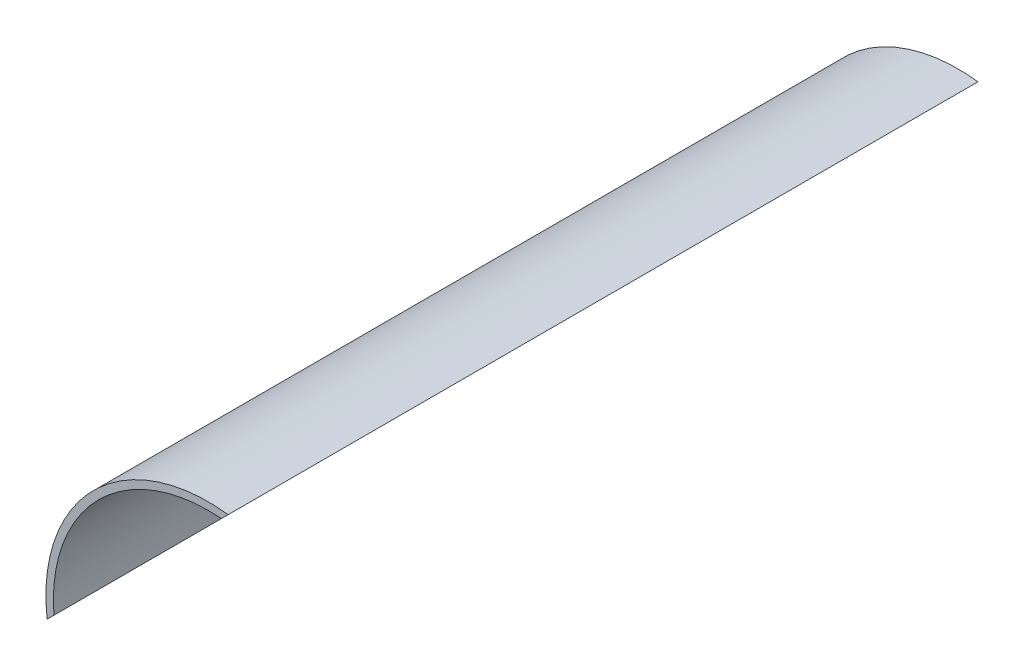
ISO-10303-21;
HEADER;
FILE_DESCRIPTION(('STEP AP214'),'2;1');
FILE_NAME('part.step','',(''),(''),'','','');
FILE_SCHEMA(('AUTOMOTIVE_DESIGN { 1 0 10303 214 1 1 1 1 }'));
ENDSEC;
DATA;
#1=APPLICATION_CONTEXT('core data for automotive mechanical design processes');
#2=APPLICATION_PROTOCOL_DEFINITION('international standard','automotive_design',2000,#1);
#3=PRODUCT_CONTEXT('',#1,'mechanical');
#4=PRODUCT('Part','Part','',(#3));
#5=PRODUCT_RELATED_PRODUCT_CATEGORY('part','',(#4));
#6=PRODUCT_DEFINITION_FORMATION('','',#4);
#7=PRODUCT_DEFINITION_CONTEXT('part definition',#1,'design');
#8=PRODUCT_DEFINITION('design','',#6,#7);
#9=PRODUCT_DEFINITION_SHAPE('','',#8);
#10=(LENGTH_UNIT() NAMED_UNIT(*) SI_UNIT(.MILLI.,.METRE.));
#11=(NAMED_UNIT(*) PLANE_ANGLE_UNIT() SI_UNIT($,.RADIAN.));
#12=(NAMED_UNIT(*) SI_UNIT($,.STERADIAN.) SOLID_ANGLE_UNIT());
#13=UNCERTAINTY_MEASURE_WITH_UNIT(LENGTH_MEASURE(1.E-05),#10,'distance_accuracy_value','');
#14=(GEOMETRIC_REPRESENTATION_CONTEXT(3) GLOBAL_UNCERTAINTY_ASSIGNED_CONTEXT((#13)) GLOBAL_UNIT_ASSIGNED_CONTEXT((#10,
#11,#12)) REPRESENTATION_CONTEXT('',''));
#15=CARTESIAN_POINT('',(0.,0.,0.));
#16=DIRECTION('',(0.,0.,1.));
#17=DIRECTION('',(1.,0.,0.));
#18=AXIS2_PLACEMENT_3D('',#15,#16,#17);
#19=CARTESIAN_POINT('',(0.,0.,300.));
#20=DIRECTION('',(0.,0.,1.));
#21=DIRECTION('',(1.,0.,0.));
#22=AXIS2_PLACEMENT_3D('',#19,#20,#21);
#23=PLANE('',#22);
#24=DIRECTION('',(0.707106781186548,0.707106781186547,0.));
#25=VECTOR('',#24,1.);
#26=CARTESIAN_POINT('',(-74.2462120245875,-17.6776695296636,300.));
#27=LINE('',#26,#25);
#28=CARTESIAN_POINT('',(5.21199720142656,61.7805396963504,300.));
#29=VERTEX_POINT('',#28);
#30=CARTESIAN_POINT('',(7.9441706180117,64.5127131129355,300.));
#31=VERTEX_POINT('',#30);
#32=EDGE_CURVE('E59',#29,#31,#27,.T.);
#33=ORIENTED_EDGE('',*,*,#32,.T.);
#34=CARTESIAN_POINT('',(0.,0.,300.));
#35=DIRECTION('',(0.,0.,1.));
#36=DIRECTION('',(1.,0.,0.));
#37=AXIS2_PLACEMENT_3D('',#34,#35,#36);
#38=CIRCLE('',#37,65.);
#39=CARTESIAN_POINT('',(-64.5127131129355,-7.94417061801168,300.));
#40=VERTEX_POINT('',#39);
#41=EDGE_CURVE('E88',#31,#40,#38,.T.);
#42=ORIENTED_EDGE('',*,*,#41,.T.);
#43=CARTESIAN_POINT('',(-61.7805396963504,-5.21199720142653,300.));
#44=VERTEX_POINT('',#43);
#45=EDGE_CURVE('E75',#40,#44,#27,.T.);
#46=ORIENTED_EDGE('',*,*,#45,.T.);
#47=CARTESIAN_POINT('',(0.,0.,300.));
#48=DIRECTION('',(0.,0.,1.));
#49=DIRECTION('',(1.,0.,0.));
#50=AXIS2_PLACEMENT_3D('',#47,#48,#49);
#51=CIRCLE('',#50,62.);
#52=EDGE_CURVE('E95',#29,#44,#51,.T.);
#53=ORIENTED_EDGE('',*,*,#52,.F.);
#54=EDGE_LOOP('',(#33,#42,#46,#53));
#55=FACE_BOUND('',#54,.T.);
#56=ADVANCED_FACE('F37',(#55),#23,.T.);
#57=CARTESIAN_POINT('',(0.,0.,0.));
#58=DIRECTION('',(0.,0.,1.));
#59=DIRECTION('',(1.,0.,0.));
#60=AXIS2_PLACEMENT_3D('',#57,#58,#59);
#61=PLANE('',#60);
#62=CARTESIAN_POINT('',(0.,0.,0.));
#63=DIRECTION('',(0.,0.,1.));
#64=DIRECTION('',(1.,0.,0.));
#65=AXIS2_PLACEMENT_3D('',#62,#63,#64);
#66=CIRCLE('',#65,65.);
#67=CARTESIAN_POINT('',(7.94417061801171,64.5127131129355,0.));
#68=VERTEX_POINT('',#67);
#69=CARTESIAN_POINT('',(-64.5127131129355,-7.94417061801168,0.));
#70=VERTEX_POINT('',#69);
#71=EDGE_CURVE('E90',#68,#70,#66,.T.);
#72=ORIENTED_EDGE('',*,*,#71,.F.);
#73=DIRECTION('',(-0.707106781186548,-0.707106781186547,0.));
#74=VECTOR('',#73,1.);
#75=CARTESIAN_POINT('',(-74.2462120245875,-17.6776695296637,0.));
#76=LINE('',#75,#74);
#77=CARTESIAN_POINT('',(5.21199720142655,61.7805396963503,0.));
#78=VERTEX_POINT('',#77);
#79=EDGE_CURVE('E92',#68,#78,#76,.T.);
#80=ORIENTED_EDGE('',*,*,#79,.T.);
#81=CARTESIAN_POINT('',(0.,0.,0.));
#82=DIRECTION('',(0.,0.,1.));
#83=DIRECTION('',(1.,0.,0.));
#84=AXIS2_PLACEMENT_3D('',#81,#82,#83);
#85=CIRCLE('',#84,62.);
#86=CARTESIAN_POINT('',(-61.7805396963504,-5.21199720142653,0.));
#87=VERTEX_POINT('',#86);
#88=EDGE_CURVE('E98',#78,#87,#85,.T.);
#89=ORIENTED_EDGE('',*,*,#88,.T.);
#90=EDGE_CURVE('E52',#87,#70,#76,.T.);
#91=ORIENTED_EDGE('',*,*,#90,.T.);
#92=EDGE_LOOP('',(#72,#80,#89,#91));
#93=FACE_BOUND('',#92,.T.);
#94=ADVANCED_FACE('F106',(#93),#61,.F.);
#95=CARTESIAN_POINT('',(0.,0.,300.));
#96=DIRECTION('',(0.,0.,-1.));
#97=DIRECTION('',(-1.,0.,0.));
#98=AXIS2_PLACEMENT_3D('',#95,#96,#97);
#99=CYLINDRICAL_SURFACE('',#98,65.);
#100=ORIENTED_EDGE('',*,*,#41,.F.);
#101=DIRECTION('',(0.,0.,-1.));
#102=VECTOR('',#101,1.);
#103=CARTESIAN_POINT('',(7.94417061801171,64.5127131129355,300.));
#104=LINE('',#103,#102);
#105=EDGE_CURVE('E91',#31,#68,#104,.T.);
#106=ORIENTED_EDGE('',*,*,#105,.T.);
#107=ORIENTED_EDGE('',*,*,#71,.T.);
#108=DIRECTION('',(0.,0.,-1.));
#109=VECTOR('',#108,1.);
#110=CARTESIAN_POINT('',(-64.5127131129355,-7.94417061801168,300.));
#111=LINE('',#110,#109);
#112=EDGE_CURVE('E78',#70,#40,#111,.F.);
#113=ORIENTED_EDGE('',*,*,#112,.T.);
#114=EDGE_LOOP('',(#100,#106,#107,#113));
#115=FACE_BOUND('',#114,.T.);
#116=ADVANCED_FACE('F39',(#115),#99,.T.);
#117=CARTESIAN_POINT('',(0.,0.,300.));
#118=DIRECTION('',(0.,0.,-1.));
#119=DIRECTION('',(-1.,0.,0.));
#120=AXIS2_PLACEMENT_3D('',#117,#118,#119);
#121=CYLINDRICAL_SURFACE('',#120,62.);
#122=DIRECTION('',(0.,0.,-1.));
#123=VECTOR('',#122,1.);
#124=CARTESIAN_POINT('',(5.21199720142656,61.7805396963504,300.));
#125=LINE('',#124,#123);
#126=EDGE_CURVE('E11',#29,#78,#125,.T.);
#127=ORIENTED_EDGE('',*,*,#126,.F.);
#128=ORIENTED_EDGE('',*,*,#52,.T.);
#129=DIRECTION('',(0.,0.,-1.));
#130=VECTOR('',#129,1.);
#131=CARTESIAN_POINT('',(-61.7805396963504,-5.21199720142653,300.));
#132=LINE('',#131,#130);
#133=EDGE_CURVE('E45',#87,#44,#132,.F.);
#134=ORIENTED_EDGE('',*,*,#133,.F.);
#135=ORIENTED_EDGE('',*,*,#88,.F.);
#136=EDGE_LOOP('',(#127,#128,#134,#135));
#137=FACE_BOUND('',#136,.T.);
#138=ADVANCED_FACE('F108',(#137),#121,.F.);
#139=CARTESIAN_POINT('',(-28.2842712474619,28.2842712474619,0.));
#140=DIRECTION('',(-0.707106781186547,0.707106781186548,0.));
#141=DIRECTION('',(-0.707106781186548,-0.707106781186547,0.));
#142=AXIS2_PLACEMENT_3D('',#139,#140,#141);
#143=PLANE('',#142);
#144=ORIENTED_EDGE('',*,*,#90,.F.);
#145=ORIENTED_EDGE('',*,*,#133,.T.);
#146=ORIENTED_EDGE('',*,*,#45,.F.);
#147=ORIENTED_EDGE('',*,*,#112,.F.);
#148=EDGE_LOOP('',(#144,#145,#146,#147));
#149=FACE_BOUND('',#148,.T.);
#150=ADVANCED_FACE('F77',(#149),#143,.F.);
#151=ORIENTED_EDGE('',*,*,#32,.F.);
#152=ORIENTED_EDGE('',*,*,#126,.T.);
#153=ORIENTED_EDGE('',*,*,#79,.F.);
#154=ORIENTED_EDGE('',*,*,#105,.F.);
#155=EDGE_LOOP('',(#151,#152,#153,#154));
#156=FACE_BOUND('',#155,.T.);
#157=ADVANCED_FACE('F109',(#156),#143,.F.);
#158=CLOSED_SHELL('',(#56,#94,#116,#138,#150,#157));
#159=MANIFOLD_SOLID_BREP('B2',#158);
#160=ADVANCED_BREP_SHAPE_REPRESENTATION('',(#18,#159),#14);
#161=SHAPE_DEFINITION_REPRESENTATION(#9,#160);
ENDSEC;
END-ISO-10303-21;
